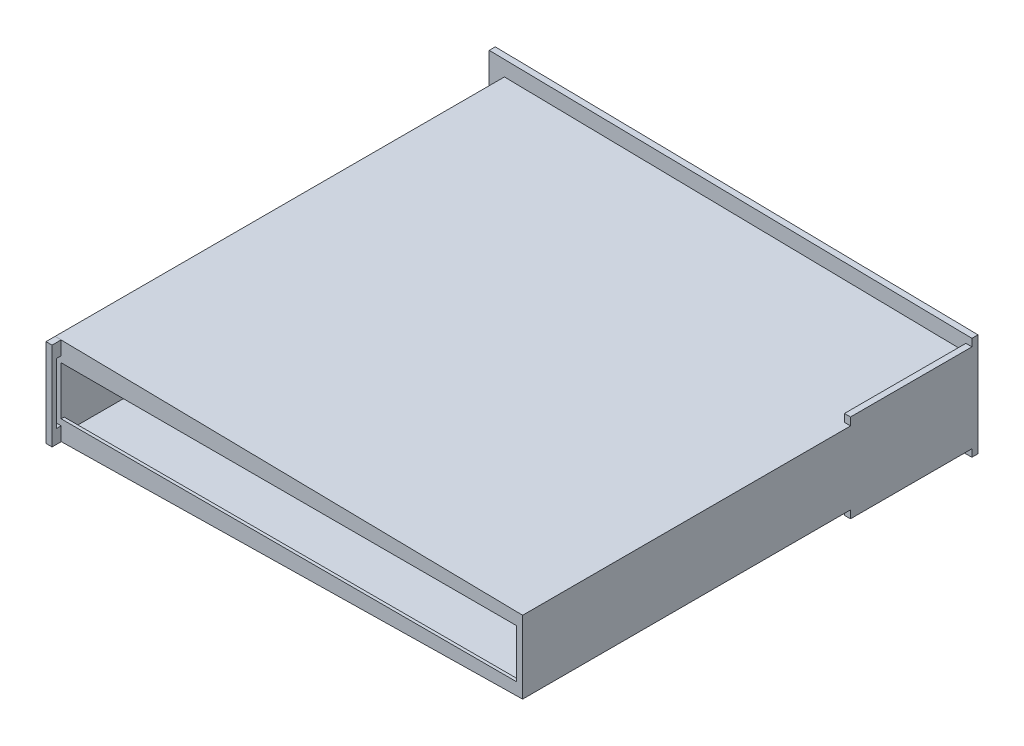
ISO-10303-21;
HEADER;
FILE_DESCRIPTION(('STEP AP214'),'2;1');
FILE_NAME('part.step','',(''),(''),'','','');
FILE_SCHEMA(('AUTOMOTIVE_DESIGN { 1 0 10303 214 1 1 1 1 }'));
ENDSEC;
DATA;
#1=APPLICATION_CONTEXT('core data for automotive mechanical design processes');
#2=APPLICATION_PROTOCOL_DEFINITION('international standard','automotive_design',2000,#1);
#3=PRODUCT_CONTEXT('',#1,'mechanical');
#4=PRODUCT('Part','Part','',(#3));
#5=PRODUCT_RELATED_PRODUCT_CATEGORY('part','',(#4));
#6=PRODUCT_DEFINITION_FORMATION('','',#4);
#7=PRODUCT_DEFINITION_CONTEXT('part definition',#1,'design');
#8=PRODUCT_DEFINITION('design','',#6,#7);
#9=PRODUCT_DEFINITION_SHAPE('','',#8);
#10=(LENGTH_UNIT() NAMED_UNIT(*) SI_UNIT(.MILLI.,.METRE.));
#11=(NAMED_UNIT(*) PLANE_ANGLE_UNIT() SI_UNIT($,.RADIAN.));
#12=(NAMED_UNIT(*) SI_UNIT($,.STERADIAN.) SOLID_ANGLE_UNIT());
#13=UNCERTAINTY_MEASURE_WITH_UNIT(LENGTH_MEASURE(1.E-05),#10,'distance_accuracy_value','');
#14=(GEOMETRIC_REPRESENTATION_CONTEXT(3) GLOBAL_UNCERTAINTY_ASSIGNED_CONTEXT((#13)) GLOBAL_UNIT_ASSIGNED_CONTEXT((#10,
#11,#12)) REPRESENTATION_CONTEXT('',''));
#15=CARTESIAN_POINT('',(0.,0.,0.));
#16=DIRECTION('',(0.,0.,1.));
#17=DIRECTION('',(1.,0.,0.));
#18=AXIS2_PLACEMENT_3D('',#15,#16,#17);
#19=CARTESIAN_POINT('',(0.449879662735191,26.9927797641114,150.));
#20=DIRECTION('',(-0.0166643523339934,-0.9998611400396,0.));
#21=DIRECTION('',(0.9998611400396,-0.0166643523339934,0.));
#22=AXIS2_PLACEMENT_3D('',#19,#20,#21);
#23=PLANE('',#22);
#24=DIRECTION('',(0.,0.,-1.));
#25=VECTOR('',#24,1.);
#26=CARTESIAN_POINT('',(152.,24.466944425157,150.));
#27=LINE('',#26,#25);
#28=CARTESIAN_POINT('',(152.,24.466944425157,150.));
#29=VERTEX_POINT('',#28);
#30=CARTESIAN_POINT('',(152.,24.466944425157,42.));
#31=VERTEX_POINT('',#30);
#32=EDGE_CURVE('E454',#29,#31,#27,.T.);
#33=ORIENTED_EDGE('',*,*,#32,.T.);
#34=DIRECTION('',(-0.9998611400396,0.0166643523339934,0.));
#35=VECTOR('',#34,1.);
#36=CARTESIAN_POINT('',(0.449879662735186,26.9927797641114,42.));
#37=LINE('',#36,#35);
#38=CARTESIAN_POINT('',(150.,24.5002777584903,42.));
#39=VERTEX_POINT('',#38);
#40=EDGE_CURVE('E288',#31,#39,#37,.T.);
#41=ORIENTED_EDGE('',*,*,#40,.T.);
#42=DIRECTION('',(0.,0.,-1.));
#43=VECTOR('',#42,1.);
#44=CARTESIAN_POINT('',(150.,24.5002777584903,150.));
#45=LINE('',#44,#43);
#46=CARTESIAN_POINT('',(150.,24.5002777584903,2.));
#47=VERTEX_POINT('',#46);
#48=EDGE_CURVE('E284',#39,#47,#45,.T.);
#49=ORIENTED_EDGE('',*,*,#48,.T.);
#50=DIRECTION('',(-0.9998611400396,0.0166643523339934,0.));
#51=VECTOR('',#50,1.);
#52=CARTESIAN_POINT('',(-2.,27.0336110918237,2.));
#53=LINE('',#52,#51);
#54=CARTESIAN_POINT('',(-2.,27.0336110918237,2.));
#55=VERTEX_POINT('',#54);
#56=EDGE_CURVE('E60',#47,#55,#53,.T.);
#57=ORIENTED_EDGE('',*,*,#56,.T.);
#58=DIRECTION('',(0.,0.,-1.));
#59=VECTOR('',#58,1.);
#60=CARTESIAN_POINT('',(-2.,27.0336110918237,150.));
#61=LINE('',#60,#59);
#62=CARTESIAN_POINT('',(-2.,27.0336110918237,150.));
#63=VERTEX_POINT('',#62);
#64=EDGE_CURVE('E452',#63,#55,#61,.T.);
#65=ORIENTED_EDGE('',*,*,#64,.F.);
#66=DIRECTION('',(0.9998611400396,-0.0166643523339934,0.));
#67=VECTOR('',#66,1.);
#68=CARTESIAN_POINT('',(0.449879662735191,26.9927797641114,150.));
#69=LINE('',#68,#67);
#70=CARTESIAN_POINT('',(0.,27.0002777584903,150.));
#71=VERTEX_POINT('',#70);
#72=EDGE_CURVE('E376',#63,#71,#69,.T.);
#73=ORIENTED_EDGE('',*,*,#72,.T.);
#74=DIRECTION('',(-0.9998611400396,0.0166643523339934,0.));
#75=VECTOR('',#74,1.);
#76=CARTESIAN_POINT('',(0.449879662735191,26.9927797641114,150.));
#77=LINE('',#76,#75);
#78=EDGE_CURVE('E423',#29,#71,#77,.T.);
#79=ORIENTED_EDGE('',*,*,#78,.F.);
#80=EDGE_LOOP('',(#33,#41,#49,#57,#65,#73,#79));
#81=FACE_BOUND('',#80,.T.);
#82=ADVANCED_FACE('F37',(#81),#23,.F.);
#83=CARTESIAN_POINT('',(-1.99999999999999,0.,150.));
#84=DIRECTION('',(1.,0.,0.));
#85=DIRECTION('',(0.,1.,0.));
#86=AXIS2_PLACEMENT_3D('',#83,#84,#85);
#87=PLANE('',#86);
#88=DIRECTION('',(0.,0.,-1.));
#89=VECTOR('',#88,1.);
#90=CARTESIAN_POINT('',(-1.99999999999999,2.5,151.5));
#91=LINE('',#90,#89);
#92=CARTESIAN_POINT('',(-1.99999999999999,2.5,151.5));
#93=VERTEX_POINT('',#92);
#94=CARTESIAN_POINT('',(-1.99999999999999,2.5,150.));
#95=VERTEX_POINT('',#94);
#96=EDGE_CURVE('E370',#93,#95,#91,.T.);
#97=ORIENTED_EDGE('',*,*,#96,.T.);
#98=DIRECTION('',(0.,-1.,0.));
#99=VECTOR('',#98,1.);
#100=CARTESIAN_POINT('',(-1.99999999999999,0.,150.));
#101=LINE('',#100,#99);
#102=CARTESIAN_POINT('',(-1.99999999999999,22.5,150.));
#103=VERTEX_POINT('',#102);
#104=EDGE_CURVE('E426',#103,#95,#101,.T.);
#105=ORIENTED_EDGE('',*,*,#104,.F.);
#106=DIRECTION('',(0.,0.,1.));
#107=VECTOR('',#106,1.);
#108=CARTESIAN_POINT('',(-1.99999999999999,22.5,150.));
#109=LINE('',#108,#107);
#110=CARTESIAN_POINT('',(-1.99999999999999,22.5,151.5));
#111=VERTEX_POINT('',#110);
#112=EDGE_CURVE('E364',#103,#111,#109,.T.);
#113=ORIENTED_EDGE('',*,*,#112,.T.);
#114=DIRECTION('',(0.,-1.,0.));
#115=VECTOR('',#114,1.);
#116=CARTESIAN_POINT('',(-1.99999999999999,22.5,151.5));
#117=LINE('',#116,#115);
#118=EDGE_CURVE('E367',#111,#93,#117,.T.);
#119=ORIENTED_EDGE('',*,*,#118,.T.);
#120=EDGE_LOOP('',(#97,#105,#113,#119));
#121=FACE_BOUND('',#120,.T.);
#122=DIRECTION('',(0.,-1.,0.));
#123=VECTOR('',#122,1.);
#124=CARTESIAN_POINT('',(-1.99999999999999,-2.03361109182367,2.));
#125=LINE('',#124,#123);
#126=CARTESIAN_POINT('',(-1.99999999999999,-2.03361109182367,2.));
#127=VERTEX_POINT('',#126);
#128=EDGE_CURVE('E293',#55,#127,#125,.T.);
#129=ORIENTED_EDGE('',*,*,#128,.T.);
#130=DIRECTION('',(0.,0.,-1.));
#131=VECTOR('',#130,1.);
#132=CARTESIAN_POINT('',(-1.99999999999999,-2.03361109182367,150.));
#133=LINE('',#132,#131);
#134=CARTESIAN_POINT('',(-1.99999999999999,-2.03361109182367,150.));
#135=VERTEX_POINT('',#134);
#136=EDGE_CURVE('E448',#135,#127,#133,.T.);
#137=ORIENTED_EDGE('',*,*,#136,.F.);
#138=DIRECTION('',(0.,0.,1.));
#139=VECTOR('',#138,1.);
#140=CARTESIAN_POINT('',(-1.99999999999999,-2.03361109182367,150.));
#141=LINE('',#140,#139);
#142=CARTESIAN_POINT('',(-1.99999999999999,-2.03361109182367,153.));
#143=VERTEX_POINT('',#142);
#144=EDGE_CURVE('E322',#135,#143,#141,.T.);
#145=ORIENTED_EDGE('',*,*,#144,.T.);
#146=DIRECTION('',(0.,1.,0.));
#147=VECTOR('',#146,1.);
#148=CARTESIAN_POINT('',(-1.99999999999999,-2.03361109182367,153.));
#149=LINE('',#148,#147);
#150=CARTESIAN_POINT('',(-1.99999999999999,27.0336110918237,153.));
#151=VERTEX_POINT('',#150);
#152=EDGE_CURVE('E358',#143,#151,#149,.T.);
#153=ORIENTED_EDGE('',*,*,#152,.T.);
#154=DIRECTION('',(0.,0.,-1.));
#155=VECTOR('',#154,1.);
#156=CARTESIAN_POINT('',(-1.99999999999999,27.0336110918237,153.));
#157=LINE('',#156,#155);
#158=EDGE_CURVE('E361',#151,#63,#157,.T.);
#159=ORIENTED_EDGE('',*,*,#158,.T.);
#160=ORIENTED_EDGE('',*,*,#64,.T.);
#161=EDGE_LOOP('',(#129,#137,#145,#153,#159,#160));
#162=FACE_BOUND('',#161,.T.);
#163=ADVANCED_FACE('F523',(#121,#162),#87,.F.);
#164=CARTESIAN_POINT('',(0.0333287046679867,-1.9997222800792,150.));
#165=DIRECTION('',(-0.0166643523339933,0.9998611400396,0.));
#166=DIRECTION('',(-0.9998611400396,-0.0166643523339933,0.));
#167=AXIS2_PLACEMENT_3D('',#164,#165,#166);
#168=PLANE('',#167);
#169=DIRECTION('',(0.,0.,-1.));
#170=VECTOR('',#169,1.);
#171=CARTESIAN_POINT('',(150.,0.499722241509667,150.));
#172=LINE('',#171,#170);
#173=CARTESIAN_POINT('',(150.,0.499722241509667,42.));
#174=VERTEX_POINT('',#173);
#175=CARTESIAN_POINT('',(150.,0.499722241509667,2.));
#176=VERTEX_POINT('',#175);
#177=EDGE_CURVE('E242',#174,#176,#172,.T.);
#178=ORIENTED_EDGE('',*,*,#177,.F.);
#179=DIRECTION('',(0.9998611400396,0.0166643523339933,0.));
#180=VECTOR('',#179,1.);
#181=CARTESIAN_POINT('',(0.0333287046679867,-1.9997222800792,42.));
#182=LINE('',#181,#180);
#183=CARTESIAN_POINT('',(152.,0.533055574843001,42.));
#184=VERTEX_POINT('',#183);
#185=EDGE_CURVE('E266',#174,#184,#182,.T.);
#186=ORIENTED_EDGE('',*,*,#185,.T.);
#187=DIRECTION('',(0.,0.,-1.));
#188=VECTOR('',#187,1.);
#189=CARTESIAN_POINT('',(152.,0.533055574843001,150.));
#190=LINE('',#189,#188);
#191=CARTESIAN_POINT('',(152.,0.533055574843001,150.));
#192=VERTEX_POINT('',#191);
#193=EDGE_CURVE('E445',#192,#184,#190,.T.);
#194=ORIENTED_EDGE('',*,*,#193,.F.);
#195=DIRECTION('',(0.9998611400396,0.0166643523339933,0.));
#196=VECTOR('',#195,1.);
#197=CARTESIAN_POINT('',(0.0333287046679867,-1.9997222800792,150.));
#198=LINE('',#197,#196);
#199=CARTESIAN_POINT('',(0.,-2.00027775849033,150.));
#200=VERTEX_POINT('',#199);
#201=EDGE_CURVE('E428',#200,#192,#198,.T.);
#202=ORIENTED_EDGE('',*,*,#201,.F.);
#203=EDGE_CURVE('E429',#135,#200,#198,.T.);
#204=ORIENTED_EDGE('',*,*,#203,.F.);
#205=ORIENTED_EDGE('',*,*,#136,.T.);
#206=DIRECTION('',(0.9998611400396,0.0166643523339933,0.));
#207=VECTOR('',#206,1.);
#208=CARTESIAN_POINT('',(152.,0.533055574843001,2.));
#209=LINE('',#208,#207);
#210=EDGE_CURVE('E296',#127,#176,#209,.T.);
#211=ORIENTED_EDGE('',*,*,#210,.T.);
#212=EDGE_LOOP('',(#178,#186,#194,#202,#204,#205,#211));
#213=FACE_BOUND('',#212,.T.);
#214=ADVANCED_FACE('F516',(#213),#168,.F.);
#215=CARTESIAN_POINT('',(150.,0.,150.));
#216=DIRECTION('',(-1.,0.,0.));
#217=DIRECTION('',(0.,0.,1.));
#218=AXIS2_PLACEMENT_3D('',#215,#216,#217);
#219=PLANE('',#218);
#220=DIRECTION('',(0.,-1.,0.));
#221=VECTOR('',#220,1.);
#222=CARTESIAN_POINT('',(150.,0.,149.));
#223=LINE('',#222,#221);
#224=CARTESIAN_POINT('',(150.,4.5,149.));
#225=VERTEX_POINT('',#224);
#226=CARTESIAN_POINT('',(150.,2.5,149.));
#227=VERTEX_POINT('',#226);
#228=EDGE_CURVE('E404',#225,#227,#223,.T.);
#229=ORIENTED_EDGE('',*,*,#228,.F.);
#230=DIRECTION('',(0.,0.,1.));
#231=VECTOR('',#230,1.);
#232=CARTESIAN_POINT('',(150.,4.5,149.));
#233=LINE('',#232,#231);
#234=CARTESIAN_POINT('',(150.,4.5,150.));
#235=VERTEX_POINT('',#234);
#236=EDGE_CURVE('E410',#225,#235,#233,.T.);
#237=ORIENTED_EDGE('',*,*,#236,.T.);
#238=DIRECTION('',(0.,1.,0.));
#239=VECTOR('',#238,1.);
#240=CARTESIAN_POINT('',(150.,0.,150.));
#241=LINE('',#240,#239);
#242=CARTESIAN_POINT('',(150.,20.5,150.));
#243=VERTEX_POINT('',#242);
#244=EDGE_CURVE('E415',#235,#243,#241,.T.);
#245=ORIENTED_EDGE('',*,*,#244,.T.);
#246=DIRECTION('',(0.,0.,1.));
#247=VECTOR('',#246,1.);
#248=CARTESIAN_POINT('',(150.,20.5,149.));
#249=LINE('',#248,#247);
#250=CARTESIAN_POINT('',(150.,20.5,149.));
#251=VERTEX_POINT('',#250);
#252=EDGE_CURVE('E472',#251,#243,#249,.T.);
#253=ORIENTED_EDGE('',*,*,#252,.F.);
#254=DIRECTION('',(0.,-1.,0.));
#255=VECTOR('',#254,1.);
#256=CARTESIAN_POINT('',(150.,0.,149.));
#257=LINE('',#256,#255);
#258=CARTESIAN_POINT('',(150.,22.5,149.));
#259=VERTEX_POINT('',#258);
#260=EDGE_CURVE('E466',#259,#251,#257,.T.);
#261=ORIENTED_EDGE('',*,*,#260,.F.);
#262=DIRECTION('',(0.,0.,-1.));
#263=VECTOR('',#262,1.);
#264=CARTESIAN_POINT('',(150.,22.5,150.));
#265=LINE('',#264,#263);
#266=CARTESIAN_POINT('',(150.,22.5,0.));
#267=VERTEX_POINT('',#266);
#268=EDGE_CURVE('E449',#259,#267,#265,.T.);
#269=ORIENTED_EDGE('',*,*,#268,.T.);
#270=DIRECTION('',(0.,1.,0.));
#271=VECTOR('',#270,1.);
#272=CARTESIAN_POINT('',(150.,0.,0.));
#273=LINE('',#272,#271);
#274=CARTESIAN_POINT('',(150.,2.5,0.));
#275=VERTEX_POINT('',#274);
#276=EDGE_CURVE('E435',#275,#267,#273,.T.);
#277=ORIENTED_EDGE('',*,*,#276,.F.);
#278=DIRECTION('',(0.,0.,-1.));
#279=VECTOR('',#278,1.);
#280=CARTESIAN_POINT('',(150.,2.5,150.));
#281=LINE('',#280,#279);
#282=EDGE_CURVE('E461',#227,#275,#281,.T.);
#283=ORIENTED_EDGE('',*,*,#282,.F.);
#284=EDGE_LOOP('',(#229,#237,#245,#253,#261,#269,#277,#283));
#285=FACE_BOUND('',#284,.T.);
#286=ADVANCED_FACE('F514',(#285),#219,.T.);
#287=CARTESIAN_POINT('',(0.,0.,150.));
#288=DIRECTION('',(1.,0.,0.));
#289=DIRECTION('',(0.,0.,-1.));
#290=AXIS2_PLACEMENT_3D('',#287,#288,#289);
#291=PLANE('',#290);
#292=DIRECTION('',(0.,-1.,0.));
#293=VECTOR('',#292,1.);
#294=CARTESIAN_POINT('',(0.,0.,150.));
#295=LINE('',#294,#293);
#296=CARTESIAN_POINT('',(0.,20.5,150.));
#297=VERTEX_POINT('',#296);
#298=CARTESIAN_POINT('',(0.,4.5,150.));
#299=VERTEX_POINT('',#298);
#300=EDGE_CURVE('E417',#297,#299,#295,.T.);
#301=ORIENTED_EDGE('',*,*,#300,.T.);
#302=DIRECTION('',(0.,0.,1.));
#303=VECTOR('',#302,1.);
#304=CARTESIAN_POINT('',(0.,4.5,149.));
#305=LINE('',#304,#303);
#306=CARTESIAN_POINT('',(0.,4.5,149.));
#307=VERTEX_POINT('',#306);
#308=EDGE_CURVE('E407',#307,#299,#305,.T.);
#309=ORIENTED_EDGE('',*,*,#308,.F.);
#310=DIRECTION('',(0.,1.,0.));
#311=VECTOR('',#310,1.);
#312=CARTESIAN_POINT('',(0.,0.,149.));
#313=LINE('',#312,#311);
#314=CARTESIAN_POINT('',(0.,0.,149.));
#315=VERTEX_POINT('',#314);
#316=EDGE_CURVE('E398',#315,#307,#313,.T.);
#317=ORIENTED_EDGE('',*,*,#316,.F.);
#318=DIRECTION('',(0.,0.,-1.));
#319=VECTOR('',#318,1.);
#320=CARTESIAN_POINT('',(0.,0.,150.));
#321=LINE('',#320,#319);
#322=CARTESIAN_POINT('',(0.,0.,0.));
#323=VERTEX_POINT('',#322);
#324=EDGE_CURVE('E459',#315,#323,#321,.T.);
#325=ORIENTED_EDGE('',*,*,#324,.T.);
#326=DIRECTION('',(0.,-1.,0.));
#327=VECTOR('',#326,1.);
#328=CARTESIAN_POINT('',(0.,0.,0.));
#329=LINE('',#328,#327);
#330=CARTESIAN_POINT('',(0.,25.,0.));
#331=VERTEX_POINT('',#330);
#332=EDGE_CURVE('E441',#331,#323,#329,.T.);
#333=ORIENTED_EDGE('',*,*,#332,.F.);
#334=DIRECTION('',(0.,0.,-1.));
#335=VECTOR('',#334,1.);
#336=CARTESIAN_POINT('',(0.,25.,150.));
#337=LINE('',#336,#335);
#338=CARTESIAN_POINT('',(0.,25.,149.));
#339=VERTEX_POINT('',#338);
#340=EDGE_CURVE('E432',#339,#331,#337,.T.);
#341=ORIENTED_EDGE('',*,*,#340,.F.);
#342=DIRECTION('',(0.,1.,0.));
#343=VECTOR('',#342,1.);
#344=CARTESIAN_POINT('',(0.,0.,149.));
#345=LINE('',#344,#343);
#346=CARTESIAN_POINT('',(0.,20.5,149.));
#347=VERTEX_POINT('',#346);
#348=EDGE_CURVE('E470',#347,#339,#345,.T.);
#349=ORIENTED_EDGE('',*,*,#348,.F.);
#350=DIRECTION('',(0.,0.,1.));
#351=VECTOR('',#350,1.);
#352=CARTESIAN_POINT('',(0.,20.5,149.));
#353=LINE('',#352,#351);
#354=EDGE_CURVE('E45',#347,#297,#353,.T.);
#355=ORIENTED_EDGE('',*,*,#354,.T.);
#356=EDGE_LOOP('',(#301,#309,#317,#325,#333,#341,#349,#355));
#357=FACE_BOUND('',#356,.T.);
#358=ADVANCED_FACE('F489',(#357),#291,.T.);
#359=CARTESIAN_POINT('',(0.,0.,150.));
#360=DIRECTION('',(-0.0166643523339933,0.9998611400396,0.));
#361=DIRECTION('',(-0.9998611400396,-0.0166643523339933,0.));
#362=AXIS2_PLACEMENT_3D('',#359,#360,#361);
#363=PLANE('',#362);
#364=ORIENTED_EDGE('',*,*,#324,.F.);
#365=DIRECTION('',(-0.9998611400396,-0.0166643523339933,0.));
#366=VECTOR('',#365,1.);
#367=CARTESIAN_POINT('',(0.,0.,149.));
#368=LINE('',#367,#366);
#369=EDGE_CURVE('E401',#227,#315,#368,.T.);
#370=ORIENTED_EDGE('',*,*,#369,.F.);
#371=ORIENTED_EDGE('',*,*,#282,.T.);
#372=DIRECTION('',(0.9998611400396,0.0166643523339933,0.));
#373=VECTOR('',#372,1.);
#374=CARTESIAN_POINT('',(0.,0.,0.));
#375=LINE('',#374,#373);
#376=EDGE_CURVE('E438',#323,#275,#375,.T.);
#377=ORIENTED_EDGE('',*,*,#376,.F.);
#378=EDGE_LOOP('',(#364,#370,#371,#377));
#379=FACE_BOUND('',#378,.T.);
#380=ADVANCED_FACE('F501',(#379),#363,.T.);
#381=CARTESIAN_POINT('',(0.,20.5,149.));
#382=DIRECTION('',(0.,1.,0.));
#383=DIRECTION('',(-1.,0.,0.));
#384=AXIS2_PLACEMENT_3D('',#381,#382,#383);
#385=PLANE('',#384);
#386=DIRECTION('',(-1.,0.,0.));
#387=VECTOR('',#386,1.);
#388=CARTESIAN_POINT('',(0.,20.5,150.));
#389=LINE('',#388,#387);
#390=EDGE_CURVE('E457',#243,#297,#389,.T.);
#391=ORIENTED_EDGE('',*,*,#390,.T.);
#392=ORIENTED_EDGE('',*,*,#354,.F.);
#393=DIRECTION('',(-1.,0.,0.));
#394=VECTOR('',#393,1.);
#395=CARTESIAN_POINT('',(0.,20.5,149.));
#396=LINE('',#395,#394);
#397=EDGE_CURVE('E464',#251,#347,#396,.T.);
#398=ORIENTED_EDGE('',*,*,#397,.F.);
#399=ORIENTED_EDGE('',*,*,#252,.T.);
#400=EDGE_LOOP('',(#391,#392,#398,#399));
#401=FACE_BOUND('',#400,.T.);
#402=ADVANCED_FACE('F39',(#401),#385,.F.);
#403=CARTESIAN_POINT('',(0.,0.,149.));
#404=DIRECTION('',(0.,0.,1.));
#405=DIRECTION('',(1.,0.,0.));
#406=AXIS2_PLACEMENT_3D('',#403,#404,#405);
#407=PLANE('',#406);
#408=ORIENTED_EDGE('',*,*,#397,.T.);
#409=ORIENTED_EDGE('',*,*,#348,.T.);
#410=DIRECTION('',(0.9998611400396,-0.0166643523339934,0.));
#411=VECTOR('',#410,1.);
#412=CARTESIAN_POINT('',(0.416550958067204,24.9930574840322,149.));
#413=LINE('',#412,#411);
#414=EDGE_CURVE('E468',#339,#259,#413,.T.);
#415=ORIENTED_EDGE('',*,*,#414,.T.);
#416=ORIENTED_EDGE('',*,*,#260,.T.);
#417=EDGE_LOOP('',(#408,#409,#415,#416));
#418=FACE_BOUND('',#417,.T.);
#419=ADVANCED_FACE('F513',(#418),#407,.F.);
#420=CARTESIAN_POINT('',(0.,0.,150.));
#421=DIRECTION('',(0.,0.,1.));
#422=DIRECTION('',(1.,0.,0.));
#423=AXIS2_PLACEMENT_3D('',#420,#421,#422);
#424=PLANE('',#423);
#425=DIRECTION('',(-1.,0.,0.));
#426=VECTOR('',#425,1.);
#427=CARTESIAN_POINT('',(0.,22.5,150.));
#428=LINE('',#427,#426);
#429=CARTESIAN_POINT('',(0.,22.5,150.));
#430=VERTEX_POINT('',#429);
#431=EDGE_CURVE('E381',#430,#103,#428,.T.);
#432=ORIENTED_EDGE('',*,*,#431,.T.);
#433=ORIENTED_EDGE('',*,*,#104,.T.);
#434=DIRECTION('',(-1.,0.,0.));
#435=VECTOR('',#434,1.);
#436=CARTESIAN_POINT('',(0.,2.5,150.));
#437=LINE('',#436,#435);
#438=CARTESIAN_POINT('',(0.,2.5,150.));
#439=VERTEX_POINT('',#438);
#440=EDGE_CURVE('E373',#439,#95,#437,.T.);
#441=ORIENTED_EDGE('',*,*,#440,.F.);
#442=DIRECTION('',(0.,-1.,0.));
#443=VECTOR('',#442,1.);
#444=CARTESIAN_POINT('',(0.,2.5,150.));
#445=LINE('',#444,#443);
#446=EDGE_CURVE('E329',#439,#200,#445,.T.);
#447=ORIENTED_EDGE('',*,*,#446,.T.);
#448=ORIENTED_EDGE('',*,*,#201,.T.);
#449=DIRECTION('',(0.,1.,0.));
#450=VECTOR('',#449,1.);
#451=CARTESIAN_POINT('',(152.,0.,150.));
#452=LINE('',#451,#450);
#453=EDGE_CURVE('E420',#192,#29,#452,.T.);
#454=ORIENTED_EDGE('',*,*,#453,.T.);
#455=ORIENTED_EDGE('',*,*,#78,.T.);
#456=DIRECTION('',(0.,-1.,0.));
#457=VECTOR('',#456,1.);
#458=CARTESIAN_POINT('',(0.,27.0336110918237,150.));
#459=LINE('',#458,#457);
#460=EDGE_CURVE('E342',#71,#430,#459,.T.);
#461=ORIENTED_EDGE('',*,*,#460,.T.);
#462=EDGE_LOOP('',(#432,#433,#441,#447,#448,#454,#455,#461));
#463=FACE_BOUND('',#462,.T.);
#464=ORIENTED_EDGE('',*,*,#244,.F.);
#465=DIRECTION('',(1.,0.,0.));
#466=VECTOR('',#465,1.);
#467=CARTESIAN_POINT('',(0.,4.5,150.));
#468=LINE('',#467,#466);
#469=EDGE_CURVE('E394',#299,#235,#468,.T.);
#470=ORIENTED_EDGE('',*,*,#469,.F.);
#471=ORIENTED_EDGE('',*,*,#300,.F.);
#472=ORIENTED_EDGE('',*,*,#390,.F.);
#473=EDGE_LOOP('',(#464,#470,#471,#472));
#474=FACE_BOUND('',#473,.T.);
#475=ADVANCED_FACE('F486',(#463,#474),#424,.T.);
#476=CARTESIAN_POINT('',(0.416550958067204,24.9930574840322,150.));
#477=DIRECTION('',(-0.0166643523339934,-0.9998611400396,0.));
#478=DIRECTION('',(0.9998611400396,-0.0166643523339934,0.));
#479=AXIS2_PLACEMENT_3D('',#476,#477,#478);
#480=PLANE('',#479);
#481=ORIENTED_EDGE('',*,*,#414,.F.);
#482=ORIENTED_EDGE('',*,*,#340,.T.);
#483=DIRECTION('',(-0.9998611400396,0.0166643523339934,0.));
#484=VECTOR('',#483,1.);
#485=CARTESIAN_POINT('',(0.416550958067204,24.9930574840322,0.));
#486=LINE('',#485,#484);
#487=EDGE_CURVE('E412',#267,#331,#486,.T.);
#488=ORIENTED_EDGE('',*,*,#487,.F.);
#489=ORIENTED_EDGE('',*,*,#268,.F.);
#490=EDGE_LOOP('',(#481,#482,#488,#489));
#491=FACE_BOUND('',#490,.T.);
#492=ADVANCED_FACE('F510',(#491),#480,.T.);
#493=CARTESIAN_POINT('',(152.,0.,150.));
#494=DIRECTION('',(-1.,0.,0.));
#495=DIRECTION('',(0.,0.,1.));
#496=AXIS2_PLACEMENT_3D('',#493,#494,#495);
#497=PLANE('',#496);
#498=ORIENTED_EDGE('',*,*,#193,.T.);
#499=DIRECTION('',(0.,-1.,0.));
#500=VECTOR('',#499,1.);
#501=CARTESIAN_POINT('',(152.,0.533055574843001,42.));
#502=LINE('',#501,#500);
#503=CARTESIAN_POINT('',(152.,-2.03361109182367,42.));
#504=VERTEX_POINT('',#503);
#505=EDGE_CURVE('E255',#184,#504,#502,.T.);
#506=ORIENTED_EDGE('',*,*,#505,.T.);
#507=DIRECTION('',(0.,0.,-1.));
#508=VECTOR('',#507,1.);
#509=CARTESIAN_POINT('',(152.,-2.03361109182367,42.));
#510=LINE('',#509,#508);
#511=CARTESIAN_POINT('',(152.,-2.03361109182367,2.));
#512=VERTEX_POINT('',#511);
#513=EDGE_CURVE('E52',#504,#512,#510,.T.);
#514=ORIENTED_EDGE('',*,*,#513,.T.);
#515=DIRECTION('',(0.,-1.,0.));
#516=VECTOR('',#515,1.);
#517=CARTESIAN_POINT('',(152.,0.533055574843001,2.));
#518=LINE('',#517,#516);
#519=CARTESIAN_POINT('',(152.,-4.46763882138283,2.));
#520=VERTEX_POINT('',#519);
#521=EDGE_CURVE('E259',#512,#520,#518,.T.);
#522=ORIENTED_EDGE('',*,*,#521,.T.);
#523=DIRECTION('',(0.,0.,-1.));
#524=VECTOR('',#523,1.);
#525=CARTESIAN_POINT('',(152.,-4.46763882138283,2.));
#526=LINE('',#525,#524);
#527=CARTESIAN_POINT('',(152.,-4.46763882138283,0.));
#528=VERTEX_POINT('',#527);
#529=EDGE_CURVE('E311',#520,#528,#526,.T.);
#530=ORIENTED_EDGE('',*,*,#529,.T.);
#531=DIRECTION('',(0.,1.,0.));
#532=VECTOR('',#531,1.);
#533=CARTESIAN_POINT('',(152.,0.,0.));
#534=LINE('',#533,#532);
#535=CARTESIAN_POINT('',(152.,29.4676388213828,0.));
#536=VERTEX_POINT('',#535);
#537=EDGE_CURVE('E418',#528,#536,#534,.T.);
#538=ORIENTED_EDGE('',*,*,#537,.T.);
#539=DIRECTION('',(0.,0.,-1.));
#540=VECTOR('',#539,1.);
#541=CARTESIAN_POINT('',(152.,29.4676388213828,2.));
#542=LINE('',#541,#540);
#543=CARTESIAN_POINT('',(152.,29.4676388213828,2.));
#544=VERTEX_POINT('',#543);
#545=EDGE_CURVE('E319',#544,#536,#542,.T.);
#546=ORIENTED_EDGE('',*,*,#545,.F.);
#547=DIRECTION('',(0.,-1.,0.));
#548=VECTOR('',#547,1.);
#549=CARTESIAN_POINT('',(152.,29.4676388213828,2.));
#550=LINE('',#549,#548);
#551=CARTESIAN_POINT('',(152.,27.0336110918237,2.));
#552=VERTEX_POINT('',#551);
#553=EDGE_CURVE('E308',#544,#552,#550,.T.);
#554=ORIENTED_EDGE('',*,*,#553,.T.);
#555=DIRECTION('',(0.,0.,1.));
#556=VECTOR('',#555,1.);
#557=CARTESIAN_POINT('',(152.,27.0336110918237,42.));
#558=LINE('',#557,#556);
#559=CARTESIAN_POINT('',(152.,27.0336110918237,42.));
#560=VERTEX_POINT('',#559);
#561=EDGE_CURVE('E269',#552,#560,#558,.T.);
#562=ORIENTED_EDGE('',*,*,#561,.T.);
#563=DIRECTION('',(0.,-1.,0.));
#564=VECTOR('',#563,1.);
#565=CARTESIAN_POINT('',(152.,24.466944425157,42.));
#566=LINE('',#565,#564);
#567=EDGE_CURVE('E274',#560,#31,#566,.T.);
#568=ORIENTED_EDGE('',*,*,#567,.T.);
#569=ORIENTED_EDGE('',*,*,#32,.F.);
#570=ORIENTED_EDGE('',*,*,#453,.F.);
#571=EDGE_LOOP('',(#498,#506,#514,#522,#530,#538,#546,#554,#562,#568,#569,#570));
#572=FACE_BOUND('',#571,.T.);
#573=ADVANCED_FACE('F536',(#572),#497,.F.);
#574=CARTESIAN_POINT('',(0.,0.,0.));
#575=DIRECTION('',(0.,0.,1.));
#576=DIRECTION('',(1.,0.,0.));
#577=AXIS2_PLACEMENT_3D('',#574,#575,#576);
#578=PLANE('',#577);
#579=ORIENTED_EDGE('',*,*,#537,.F.);
#580=DIRECTION('',(-0.9998611400396,-0.0166643523339933,0.));
#581=VECTOR('',#580,1.);
#582=CARTESIAN_POINT('',(152.,-4.46763882138283,0.));
#583=LINE('',#582,#581);
#584=CARTESIAN_POINT('',(-6.99999999999999,-7.11763882138283,0.));
#585=VERTEX_POINT('',#584);
#586=EDGE_CURVE('E291',#528,#585,#583,.T.);
#587=ORIENTED_EDGE('',*,*,#586,.T.);
#588=DIRECTION('',(0.,1.,0.));
#589=VECTOR('',#588,1.);
#590=CARTESIAN_POINT('',(-6.99999999999999,-7.11763882138283,0.));
#591=LINE('',#590,#589);
#592=CARTESIAN_POINT('',(-6.99999999999999,32.1176388213828,0.));
#593=VERTEX_POINT('',#592);
#594=EDGE_CURVE('E314',#585,#593,#591,.T.);
#595=ORIENTED_EDGE('',*,*,#594,.T.);
#596=DIRECTION('',(0.9998611400396,-0.0166643523339934,0.));
#597=VECTOR('',#596,1.);
#598=CARTESIAN_POINT('',(-6.99999999999999,32.1176388213828,0.));
#599=LINE('',#598,#597);
#600=EDGE_CURVE('E294',#593,#536,#599,.T.);
#601=ORIENTED_EDGE('',*,*,#600,.T.);
#602=EDGE_LOOP('',(#579,#587,#595,#601));
#603=FACE_BOUND('',#602,.T.);
#604=ORIENTED_EDGE('',*,*,#487,.T.);
#605=ORIENTED_EDGE('',*,*,#332,.T.);
#606=ORIENTED_EDGE('',*,*,#376,.T.);
#607=ORIENTED_EDGE('',*,*,#276,.T.);
#608=EDGE_LOOP('',(#604,#605,#606,#607));
#609=FACE_BOUND('',#608,.T.);
#610=ADVANCED_FACE('F505',(#603,#609),#578,.F.);
#611=CARTESIAN_POINT('',(0.,4.5,149.));
#612=DIRECTION('',(0.,-1.,0.));
#613=DIRECTION('',(0.,0.,-1.));
#614=AXIS2_PLACEMENT_3D('',#611,#612,#613);
#615=PLANE('',#614);
#616=ORIENTED_EDGE('',*,*,#469,.T.);
#617=ORIENTED_EDGE('',*,*,#236,.F.);
#618=DIRECTION('',(1.,0.,0.));
#619=VECTOR('',#618,1.);
#620=CARTESIAN_POINT('',(0.,4.5,149.));
#621=LINE('',#620,#619);
#622=EDGE_CURVE('E395',#307,#225,#621,.T.);
#623=ORIENTED_EDGE('',*,*,#622,.F.);
#624=ORIENTED_EDGE('',*,*,#308,.T.);
#625=EDGE_LOOP('',(#616,#617,#623,#624));
#626=FACE_BOUND('',#625,.T.);
#627=ADVANCED_FACE('F493',(#626),#615,.F.);
#628=CARTESIAN_POINT('',(0.,0.,149.));
#629=DIRECTION('',(0.,0.,1.));
#630=DIRECTION('',(1.,0.,0.));
#631=AXIS2_PLACEMENT_3D('',#628,#629,#630);
#632=PLANE('',#631);
#633=ORIENTED_EDGE('',*,*,#622,.T.);
#634=ORIENTED_EDGE('',*,*,#228,.T.);
#635=ORIENTED_EDGE('',*,*,#369,.T.);
#636=ORIENTED_EDGE('',*,*,#316,.T.);
#637=EDGE_LOOP('',(#633,#634,#635,#636));
#638=FACE_BOUND('',#637,.T.);
#639=ADVANCED_FACE('F496',(#638),#632,.F.);
#640=CARTESIAN_POINT('',(0.,27.0336110918237,150.));
#641=DIRECTION('',(0.,0.,-1.));
#642=DIRECTION('',(-1.,0.,0.));
#643=AXIS2_PLACEMENT_3D('',#640,#641,#642);
#644=PLANE('',#643);
#645=ORIENTED_EDGE('',*,*,#72,.F.);
#646=DIRECTION('',(-1.,0.,0.));
#647=VECTOR('',#646,1.);
#648=CARTESIAN_POINT('',(0.,27.0336110918237,150.));
#649=LINE('',#648,#647);
#650=CARTESIAN_POINT('',(0.,27.0336110918237,150.));
#651=VERTEX_POINT('',#650);
#652=EDGE_CURVE('E384',#651,#63,#649,.T.);
#653=ORIENTED_EDGE('',*,*,#652,.F.);
#654=EDGE_CURVE('E343',#651,#71,#459,.T.);
#655=ORIENTED_EDGE('',*,*,#654,.T.);
#656=EDGE_LOOP('',(#645,#653,#655));
#657=FACE_BOUND('',#656,.T.);
#658=ADVANCED_FACE('F581',(#657),#644,.T.);
#659=CARTESIAN_POINT('',(0.,2.5,150.));
#660=DIRECTION('',(0.,0.,-1.));
#661=DIRECTION('',(-1.,0.,0.));
#662=AXIS2_PLACEMENT_3D('',#659,#660,#661);
#663=PLANE('',#662);
#664=ORIENTED_EDGE('',*,*,#203,.T.);
#665=CARTESIAN_POINT('',(0.,-2.03361109182367,150.));
#666=VERTEX_POINT('',#665);
#667=EDGE_CURVE('E333',#200,#666,#445,.T.);
#668=ORIENTED_EDGE('',*,*,#667,.T.);
#669=DIRECTION('',(-1.,0.,0.));
#670=VECTOR('',#669,1.);
#671=CARTESIAN_POINT('',(0.,-2.03361109182367,150.));
#672=LINE('',#671,#670);
#673=EDGE_CURVE('E355',#666,#135,#672,.T.);
#674=ORIENTED_EDGE('',*,*,#673,.T.);
#675=EDGE_LOOP('',(#664,#668,#674));
#676=FACE_BOUND('',#675,.T.);
#677=ADVANCED_FACE('F588',(#676),#663,.T.);
#678=CARTESIAN_POINT('',(0.,2.5,151.5));
#679=DIRECTION('',(0.,1.,0.));
#680=DIRECTION('',(0.,0.,1.));
#681=AXIS2_PLACEMENT_3D('',#678,#679,#680);
#682=PLANE('',#681);
#683=ORIENTED_EDGE('',*,*,#96,.F.);
#684=DIRECTION('',(-1.,0.,0.));
#685=VECTOR('',#684,1.);
#686=CARTESIAN_POINT('',(0.,2.5,151.5));
#687=LINE('',#686,#685);
#688=CARTESIAN_POINT('',(0.,2.5,151.5));
#689=VERTEX_POINT('',#688);
#690=EDGE_CURVE('E377',#689,#93,#687,.T.);
#691=ORIENTED_EDGE('',*,*,#690,.F.);
#692=DIRECTION('',(0.,0.,-1.));
#693=VECTOR('',#692,1.);
#694=CARTESIAN_POINT('',(0.,2.5,151.5));
#695=LINE('',#694,#693);
#696=EDGE_CURVE('E352',#689,#439,#695,.T.);
#697=ORIENTED_EDGE('',*,*,#696,.T.);
#698=ORIENTED_EDGE('',*,*,#440,.T.);
#699=EDGE_LOOP('',(#683,#691,#697,#698));
#700=FACE_BOUND('',#699,.T.);
#701=ADVANCED_FACE('F596',(#700),#682,.T.);
#702=CARTESIAN_POINT('',(0.,22.5,151.5));
#703=DIRECTION('',(0.,0.,-1.));
#704=DIRECTION('',(-1.,0.,0.));
#705=AXIS2_PLACEMENT_3D('',#702,#703,#704);
#706=PLANE('',#705);
#707=ORIENTED_EDGE('',*,*,#118,.F.);
#708=DIRECTION('',(-1.,0.,0.));
#709=VECTOR('',#708,1.);
#710=CARTESIAN_POINT('',(0.,22.5,151.5));
#711=LINE('',#710,#709);
#712=CARTESIAN_POINT('',(0.,22.5,151.5));
#713=VERTEX_POINT('',#712);
#714=EDGE_CURVE('E379',#713,#111,#711,.T.);
#715=ORIENTED_EDGE('',*,*,#714,.F.);
#716=DIRECTION('',(0.,-1.,0.));
#717=VECTOR('',#716,1.);
#718=CARTESIAN_POINT('',(0.,22.5,151.5));
#719=LINE('',#718,#717);
#720=EDGE_CURVE('E349',#713,#689,#719,.T.);
#721=ORIENTED_EDGE('',*,*,#720,.T.);
#722=ORIENTED_EDGE('',*,*,#690,.T.);
#723=EDGE_LOOP('',(#707,#715,#721,#722));
#724=FACE_BOUND('',#723,.T.);
#725=ADVANCED_FACE('F604',(#724),#706,.T.);
#726=CARTESIAN_POINT('',(0.,22.5,150.));
#727=DIRECTION('',(0.,-1.,0.));
#728=DIRECTION('',(0.,0.,-1.));
#729=AXIS2_PLACEMENT_3D('',#726,#727,#728);
#730=PLANE('',#729);
#731=ORIENTED_EDGE('',*,*,#112,.F.);
#732=ORIENTED_EDGE('',*,*,#431,.F.);
#733=DIRECTION('',(0.,0.,1.));
#734=VECTOR('',#733,1.);
#735=CARTESIAN_POINT('',(0.,22.5,150.));
#736=LINE('',#735,#734);
#737=EDGE_CURVE('E346',#430,#713,#736,.T.);
#738=ORIENTED_EDGE('',*,*,#737,.T.);
#739=ORIENTED_EDGE('',*,*,#714,.T.);
#740=EDGE_LOOP('',(#731,#732,#738,#739));
#741=FACE_BOUND('',#740,.T.);
#742=ADVANCED_FACE('F612',(#741),#730,.T.);
#743=CARTESIAN_POINT('',(0.,27.0336110918237,153.));
#744=DIRECTION('',(0.,1.,0.));
#745=DIRECTION('',(0.,0.,1.));
#746=AXIS2_PLACEMENT_3D('',#743,#744,#745);
#747=PLANE('',#746);
#748=ORIENTED_EDGE('',*,*,#158,.F.);
#749=DIRECTION('',(-1.,0.,0.));
#750=VECTOR('',#749,1.);
#751=CARTESIAN_POINT('',(0.,27.0336110918237,153.));
#752=LINE('',#751,#750);
#753=CARTESIAN_POINT('',(0.,27.0336110918237,153.));
#754=VERTEX_POINT('',#753);
#755=EDGE_CURVE('E387',#754,#151,#752,.T.);
#756=ORIENTED_EDGE('',*,*,#755,.F.);
#757=DIRECTION('',(0.,0.,-1.));
#758=VECTOR('',#757,1.);
#759=CARTESIAN_POINT('',(0.,27.0336110918237,153.));
#760=LINE('',#759,#758);
#761=EDGE_CURVE('E339',#754,#651,#760,.T.);
#762=ORIENTED_EDGE('',*,*,#761,.T.);
#763=ORIENTED_EDGE('',*,*,#652,.T.);
#764=EDGE_LOOP('',(#748,#756,#762,#763));
#765=FACE_BOUND('',#764,.T.);
#766=ADVANCED_FACE('F620',(#765),#747,.T.);
#767=CARTESIAN_POINT('',(0.,-2.03361109182367,153.));
#768=DIRECTION('',(0.,0.,1.));
#769=DIRECTION('',(1.,0.,0.));
#770=AXIS2_PLACEMENT_3D('',#767,#768,#769);
#771=PLANE('',#770);
#772=ORIENTED_EDGE('',*,*,#152,.F.);
#773=DIRECTION('',(-1.,0.,0.));
#774=VECTOR('',#773,1.);
#775=CARTESIAN_POINT('',(0.,-2.03361109182367,153.));
#776=LINE('',#775,#774);
#777=CARTESIAN_POINT('',(0.,-2.03361109182367,153.));
#778=VERTEX_POINT('',#777);
#779=EDGE_CURVE('E389',#778,#143,#776,.T.);
#780=ORIENTED_EDGE('',*,*,#779,.F.);
#781=DIRECTION('',(0.,1.,0.));
#782=VECTOR('',#781,1.);
#783=CARTESIAN_POINT('',(0.,-2.03361109182367,153.));
#784=LINE('',#783,#782);
#785=EDGE_CURVE('E336',#778,#754,#784,.T.);
#786=ORIENTED_EDGE('',*,*,#785,.T.);
#787=ORIENTED_EDGE('',*,*,#755,.T.);
#788=EDGE_LOOP('',(#772,#780,#786,#787));
#789=FACE_BOUND('',#788,.T.);
#790=ADVANCED_FACE('F628',(#789),#771,.T.);
#791=CARTESIAN_POINT('',(0.,-2.03361109182367,150.));
#792=DIRECTION('',(0.,-1.,0.));
#793=DIRECTION('',(0.,0.,-1.));
#794=AXIS2_PLACEMENT_3D('',#791,#792,#793);
#795=PLANE('',#794);
#796=ORIENTED_EDGE('',*,*,#144,.F.);
#797=ORIENTED_EDGE('',*,*,#673,.F.);
#798=DIRECTION('',(0.,0.,1.));
#799=VECTOR('',#798,1.);
#800=CARTESIAN_POINT('',(0.,-2.03361109182367,150.));
#801=LINE('',#800,#799);
#802=EDGE_CURVE('E332',#666,#778,#801,.T.);
#803=ORIENTED_EDGE('',*,*,#802,.T.);
#804=ORIENTED_EDGE('',*,*,#779,.T.);
#805=EDGE_LOOP('',(#796,#797,#803,#804));
#806=FACE_BOUND('',#805,.T.);
#807=ADVANCED_FACE('F636',(#806),#795,.T.);
#808=CARTESIAN_POINT('',(0.,0.,0.));
#809=DIRECTION('',(-1.,0.,0.));
#810=DIRECTION('',(0.,0.,1.));
#811=AXIS2_PLACEMENT_3D('',#808,#809,#810);
#812=PLANE('',#811);
#813=ORIENTED_EDGE('',*,*,#446,.F.);
#814=ORIENTED_EDGE('',*,*,#696,.F.);
#815=ORIENTED_EDGE('',*,*,#720,.F.);
#816=ORIENTED_EDGE('',*,*,#737,.F.);
#817=ORIENTED_EDGE('',*,*,#460,.F.);
#818=ORIENTED_EDGE('',*,*,#654,.F.);
#819=ORIENTED_EDGE('',*,*,#761,.F.);
#820=ORIENTED_EDGE('',*,*,#785,.F.);
#821=ORIENTED_EDGE('',*,*,#802,.F.);
#822=ORIENTED_EDGE('',*,*,#667,.F.);
#823=EDGE_LOOP('',(#813,#814,#815,#816,#817,#818,#819,#820,#821,#822));
#824=FACE_BOUND('',#823,.T.);
#825=ADVANCED_FACE('F644',(#824),#812,.F.);
#826=CARTESIAN_POINT('',(-6.99999999999999,32.1176388213828,2.));
#827=DIRECTION('',(0.0166643523339934,0.9998611400396,0.));
#828=DIRECTION('',(-0.9998611400396,0.0166643523339934,0.));
#829=AXIS2_PLACEMENT_3D('',#826,#827,#828);
#830=PLANE('',#829);
#831=ORIENTED_EDGE('',*,*,#600,.F.);
#832=DIRECTION('',(0.,0.,-1.));
#833=VECTOR('',#832,1.);
#834=CARTESIAN_POINT('',(-6.99999999999999,32.1176388213828,2.));
#835=LINE('',#834,#833);
#836=CARTESIAN_POINT('',(-6.99999999999999,32.1176388213828,2.));
#837=VERTEX_POINT('',#836);
#838=EDGE_CURVE('E323',#837,#593,#835,.T.);
#839=ORIENTED_EDGE('',*,*,#838,.F.);
#840=DIRECTION('',(0.9998611400396,-0.0166643523339934,0.));
#841=VECTOR('',#840,1.);
#842=CARTESIAN_POINT('',(-6.99999999999999,32.1176388213828,2.));
#843=LINE('',#842,#841);
#844=EDGE_CURVE('E305',#837,#544,#843,.T.);
#845=ORIENTED_EDGE('',*,*,#844,.T.);
#846=ORIENTED_EDGE('',*,*,#545,.T.);
#847=EDGE_LOOP('',(#831,#839,#845,#846));
#848=FACE_BOUND('',#847,.T.);
#849=ADVANCED_FACE('F652',(#848),#830,.T.);
#850=CARTESIAN_POINT('',(-6.99999999999999,-7.11763882138283,2.));
#851=DIRECTION('',(-1.,0.,0.));
#852=DIRECTION('',(0.,0.,1.));
#853=AXIS2_PLACEMENT_3D('',#850,#851,#852);
#854=PLANE('',#853);
#855=ORIENTED_EDGE('',*,*,#594,.F.);
#856=DIRECTION('',(0.,0.,-1.));
#857=VECTOR('',#856,1.);
#858=CARTESIAN_POINT('',(-6.99999999999999,-7.11763882138283,2.));
#859=LINE('',#858,#857);
#860=CARTESIAN_POINT('',(-6.99999999999999,-7.11763882138283,2.));
#861=VERTEX_POINT('',#860);
#862=EDGE_CURVE('E325',#861,#585,#859,.T.);
#863=ORIENTED_EDGE('',*,*,#862,.F.);
#864=DIRECTION('',(0.,1.,0.));
#865=VECTOR('',#864,1.);
#866=CARTESIAN_POINT('',(-6.99999999999999,-7.11763882138283,2.));
#867=LINE('',#866,#865);
#868=EDGE_CURVE('E302',#861,#837,#867,.T.);
#869=ORIENTED_EDGE('',*,*,#868,.T.);
#870=ORIENTED_EDGE('',*,*,#838,.T.);
#871=EDGE_LOOP('',(#855,#863,#869,#870));
#872=FACE_BOUND('',#871,.T.);
#873=ADVANCED_FACE('F659',(#872),#854,.T.);
#874=CARTESIAN_POINT('',(152.,-4.46763882138283,2.));
#875=DIRECTION('',(0.0166643523339933,-0.9998611400396,0.));
#876=DIRECTION('',(0.9998611400396,0.0166643523339933,0.));
#877=AXIS2_PLACEMENT_3D('',#874,#875,#876);
#878=PLANE('',#877);
#879=ORIENTED_EDGE('',*,*,#586,.F.);
#880=ORIENTED_EDGE('',*,*,#529,.F.);
#881=DIRECTION('',(-0.9998611400396,-0.0166643523339933,0.));
#882=VECTOR('',#881,1.);
#883=CARTESIAN_POINT('',(152.,-4.46763882138283,2.));
#884=LINE('',#883,#882);
#885=EDGE_CURVE('E299',#520,#861,#884,.T.);
#886=ORIENTED_EDGE('',*,*,#885,.T.);
#887=ORIENTED_EDGE('',*,*,#862,.T.);
#888=EDGE_LOOP('',(#879,#880,#886,#887));
#889=FACE_BOUND('',#888,.T.);
#890=ADVANCED_FACE('F667',(#889),#878,.T.);
#891=CARTESIAN_POINT('',(0.,0.,2.));
#892=DIRECTION('',(0.,0.,-1.));
#893=DIRECTION('',(-1.,0.,0.));
#894=AXIS2_PLACEMENT_3D('',#891,#892,#893);
#895=PLANE('',#894);
#896=ORIENTED_EDGE('',*,*,#521,.F.);
#897=DIRECTION('',(1.,0.,0.));
#898=VECTOR('',#897,1.);
#899=CARTESIAN_POINT('',(150.,-2.03361109182366,2.));
#900=LINE('',#899,#898);
#901=CARTESIAN_POINT('',(150.,-2.03361109182366,2.));
#902=VERTEX_POINT('',#901);
#903=EDGE_CURVE('E252',#902,#512,#900,.T.);
#904=ORIENTED_EDGE('',*,*,#903,.F.);
#905=DIRECTION('',(0.,1.,0.));
#906=VECTOR('',#905,1.);
#907=CARTESIAN_POINT('',(150.,-2.03361109182366,2.));
#908=LINE('',#907,#906);
#909=EDGE_CURVE('E236',#902,#176,#908,.T.);
#910=ORIENTED_EDGE('',*,*,#909,.T.);
#911=ORIENTED_EDGE('',*,*,#210,.F.);
#912=ORIENTED_EDGE('',*,*,#128,.F.);
#913=ORIENTED_EDGE('',*,*,#56,.F.);
#914=DIRECTION('',(0.,1.,0.));
#915=VECTOR('',#914,1.);
#916=CARTESIAN_POINT('',(150.,0.,2.));
#917=LINE('',#916,#915);
#918=CARTESIAN_POINT('',(150.,27.0336110918237,2.));
#919=VERTEX_POINT('',#918);
#920=EDGE_CURVE('E11',#47,#919,#917,.T.);
#921=ORIENTED_EDGE('',*,*,#920,.T.);
#922=DIRECTION('',(1.,0.,0.));
#923=VECTOR('',#922,1.);
#924=CARTESIAN_POINT('',(150.,27.0336110918237,2.));
#925=LINE('',#924,#923);
#926=EDGE_CURVE('E277',#919,#552,#925,.T.);
#927=ORIENTED_EDGE('',*,*,#926,.T.);
#928=ORIENTED_EDGE('',*,*,#553,.F.);
#929=ORIENTED_EDGE('',*,*,#844,.F.);
#930=ORIENTED_EDGE('',*,*,#868,.F.);
#931=ORIENTED_EDGE('',*,*,#885,.F.);
#932=EDGE_LOOP('',(#896,#904,#910,#911,#912,#913,#921,#927,#928,#929,#930,#931));
#933=FACE_BOUND('',#932,.T.);
#934=ADVANCED_FACE('F257',(#933),#895,.F.);
#935=CARTESIAN_POINT('',(150.,24.466944425157,42.));
#936=DIRECTION('',(0.,0.,1.));
#937=DIRECTION('',(0.,-1.,0.));
#938=AXIS2_PLACEMENT_3D('',#935,#936,#937);
#939=PLANE('',#938);
#940=ORIENTED_EDGE('',*,*,#40,.F.);
#941=ORIENTED_EDGE('',*,*,#567,.F.);
#942=DIRECTION('',(1.,0.,0.));
#943=VECTOR('',#942,1.);
#944=CARTESIAN_POINT('',(150.,27.0336110918237,42.));
#945=LINE('',#944,#943);
#946=CARTESIAN_POINT('',(150.,27.0336110918237,42.));
#947=VERTEX_POINT('',#946);
#948=EDGE_CURVE('E282',#947,#560,#945,.T.);
#949=ORIENTED_EDGE('',*,*,#948,.F.);
#950=DIRECTION('',(0.,-1.,0.));
#951=VECTOR('',#950,1.);
#952=CARTESIAN_POINT('',(150.,24.466944425157,42.));
#953=LINE('',#952,#951);
#954=EDGE_CURVE('E273',#947,#39,#953,.T.);
#955=ORIENTED_EDGE('',*,*,#954,.T.);
#956=EDGE_LOOP('',(#940,#941,#949,#955));
#957=FACE_BOUND('',#956,.T.);
#958=ADVANCED_FACE('F682',(#957),#939,.T.);
#959=CARTESIAN_POINT('',(150.,0.,0.));
#960=DIRECTION('',(-1.,0.,0.));
#961=DIRECTION('',(0.,0.,1.));
#962=AXIS2_PLACEMENT_3D('',#959,#960,#961);
#963=PLANE('',#962);
#964=ORIENTED_EDGE('',*,*,#48,.F.);
#965=ORIENTED_EDGE('',*,*,#954,.F.);
#966=DIRECTION('',(0.,0.,1.));
#967=VECTOR('',#966,1.);
#968=CARTESIAN_POINT('',(150.,27.0336110918237,42.));
#969=LINE('',#968,#967);
#970=EDGE_CURVE('E270',#919,#947,#969,.T.);
#971=ORIENTED_EDGE('',*,*,#970,.F.);
#972=ORIENTED_EDGE('',*,*,#920,.F.);
#973=EDGE_LOOP('',(#964,#965,#971,#972));
#974=FACE_BOUND('',#973,.T.);
#975=ADVANCED_FACE('F689',(#974),#963,.T.);
#976=CARTESIAN_POINT('',(150.,27.0336110918237,42.));
#977=DIRECTION('',(0.,1.,0.));
#978=DIRECTION('',(0.,0.,1.));
#979=AXIS2_PLACEMENT_3D('',#976,#977,#978);
#980=PLANE('',#979);
#981=ORIENTED_EDGE('',*,*,#561,.F.);
#982=ORIENTED_EDGE('',*,*,#926,.F.);
#983=ORIENTED_EDGE('',*,*,#970,.T.);
#984=ORIENTED_EDGE('',*,*,#948,.T.);
#985=EDGE_LOOP('',(#981,#982,#983,#984));
#986=FACE_BOUND('',#985,.T.);
#987=ADVANCED_FACE('F697',(#986),#980,.T.);
#988=CARTESIAN_POINT('',(150.,0.533055574843001,42.));
#989=DIRECTION('',(0.,0.,1.));
#990=DIRECTION('',(1.,0.,0.));
#991=AXIS2_PLACEMENT_3D('',#988,#989,#990);
#992=PLANE('',#991);
#993=ORIENTED_EDGE('',*,*,#185,.F.);
#994=DIRECTION('',(0.,-1.,0.));
#995=VECTOR('',#994,1.);
#996=CARTESIAN_POINT('',(150.,0.533055574843001,42.));
#997=LINE('',#996,#995);
#998=CARTESIAN_POINT('',(150.,-2.03361109182367,42.));
#999=VERTEX_POINT('',#998);
#1000=EDGE_CURVE('E247',#174,#999,#997,.T.);
#1001=ORIENTED_EDGE('',*,*,#1000,.T.);
#1002=DIRECTION('',(1.,0.,0.));
#1003=VECTOR('',#1002,1.);
#1004=CARTESIAN_POINT('',(150.,-2.03361109182367,42.));
#1005=LINE('',#1004,#1003);
#1006=EDGE_CURVE('E254',#999,#504,#1005,.T.);
#1007=ORIENTED_EDGE('',*,*,#1006,.T.);
#1008=ORIENTED_EDGE('',*,*,#505,.F.);
#1009=EDGE_LOOP('',(#993,#1001,#1007,#1008));
#1010=FACE_BOUND('',#1009,.T.);
#1011=ADVANCED_FACE('F705',(#1010),#992,.T.);
#1012=CARTESIAN_POINT('',(150.,0.,0.));
#1013=DIRECTION('',(1.,0.,0.));
#1014=DIRECTION('',(0.,0.,-1.));
#1015=AXIS2_PLACEMENT_3D('',#1012,#1013,#1014);
#1016=PLANE('',#1015);
#1017=ORIENTED_EDGE('',*,*,#1000,.F.);
#1018=ORIENTED_EDGE('',*,*,#177,.T.);
#1019=ORIENTED_EDGE('',*,*,#909,.F.);
#1020=DIRECTION('',(0.,0.,-1.));
#1021=VECTOR('',#1020,1.);
#1022=CARTESIAN_POINT('',(150.,-2.03361109182367,42.));
#1023=LINE('',#1022,#1021);
#1024=EDGE_CURVE('E240',#999,#902,#1023,.T.);
#1025=ORIENTED_EDGE('',*,*,#1024,.F.);
#1026=EDGE_LOOP('',(#1017,#1018,#1019,#1025));
#1027=FACE_BOUND('',#1026,.T.);
#1028=ADVANCED_FACE('F239',(#1027),#1016,.F.);
#1029=CARTESIAN_POINT('',(150.,-2.03361109182367,42.));
#1030=DIRECTION('',(0.,-1.,0.));
#1031=DIRECTION('',(0.,0.,-1.));
#1032=AXIS2_PLACEMENT_3D('',#1029,#1030,#1031);
#1033=PLANE('',#1032);
#1034=ORIENTED_EDGE('',*,*,#513,.F.);
#1035=ORIENTED_EDGE('',*,*,#1006,.F.);
#1036=ORIENTED_EDGE('',*,*,#1024,.T.);
#1037=ORIENTED_EDGE('',*,*,#903,.T.);
#1038=EDGE_LOOP('',(#1034,#1035,#1036,#1037));
#1039=FACE_BOUND('',#1038,.T.);
#1040=ADVANCED_FACE('F251',(#1039),#1033,.T.);
#1041=CLOSED_SHELL('',(#82,#163,#214,#286,#358,#380,#402,#419,#475,#492,#573,#610,#627,#639,
#658,#677,#701,#725,#742,#766,#790,#807,#825,#849,#873,#890,#934,#958,#975,#987,#1011,#1028,#1040));
#1042=MANIFOLD_SOLID_BREP('B2',#1041);
#1043=ADVANCED_BREP_SHAPE_REPRESENTATION('',(#18,#1042),#14);
#1044=SHAPE_DEFINITION_REPRESENTATION(#9,#1043);
ENDSEC;
END-ISO-10303-21;
